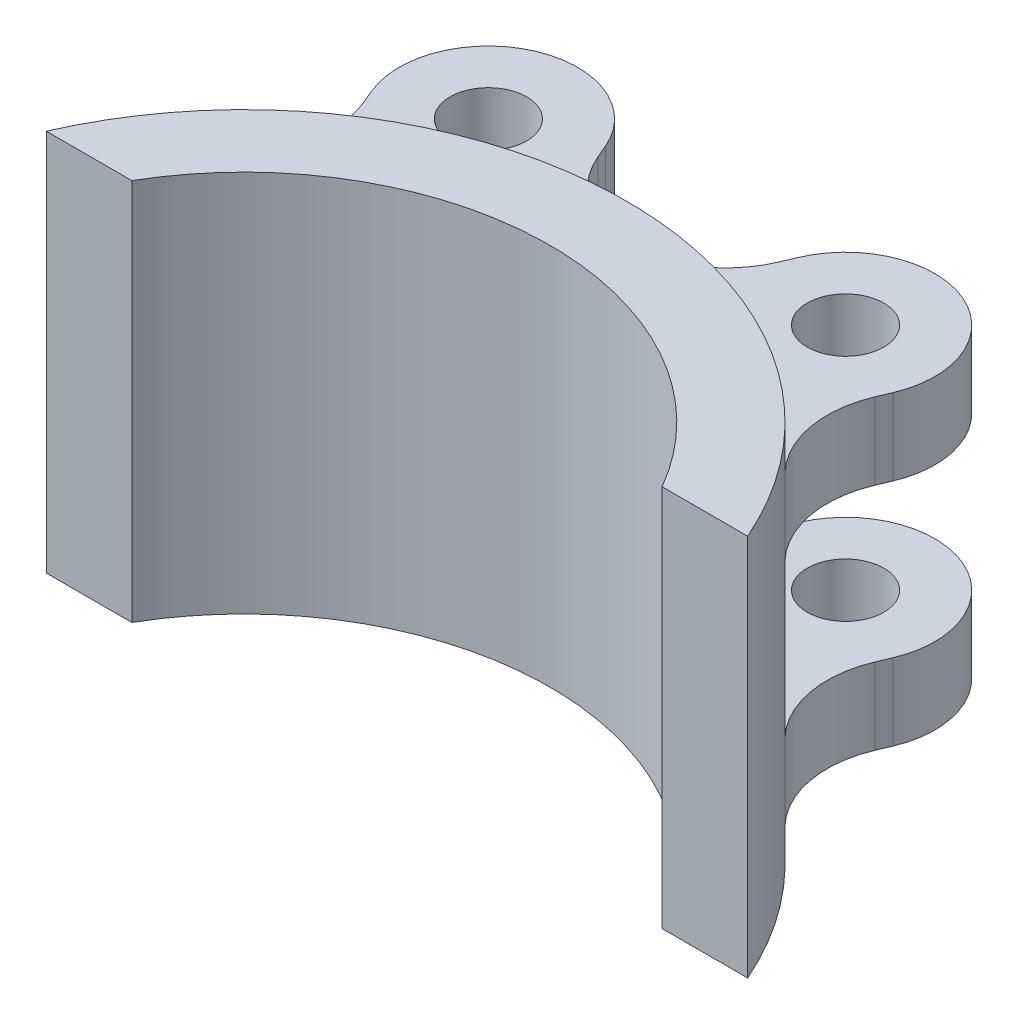
ISO-10303-21;
HEADER;
FILE_DESCRIPTION(('STEP AP214'),'2;1');
FILE_NAME('part.step','',(''),(''),'','','');
FILE_SCHEMA(('AUTOMOTIVE_DESIGN { 1 0 10303 214 1 1 1 1 }'));
ENDSEC;
DATA;
#1=APPLICATION_CONTEXT('core data for automotive mechanical design processes');
#2=APPLICATION_PROTOCOL_DEFINITION('international standard','automotive_design',2000,#1);
#3=PRODUCT_CONTEXT('',#1,'mechanical');
#4=PRODUCT('Part','Part','',(#3));
#5=PRODUCT_RELATED_PRODUCT_CATEGORY('part','',(#4));
#6=PRODUCT_DEFINITION_FORMATION('','',#4);
#7=PRODUCT_DEFINITION_CONTEXT('part definition',#1,'design');
#8=PRODUCT_DEFINITION('design','',#6,#7);
#9=PRODUCT_DEFINITION_SHAPE('','',#8);
#10=(LENGTH_UNIT() NAMED_UNIT(*) SI_UNIT(.MILLI.,.METRE.));
#11=(NAMED_UNIT(*) PLANE_ANGLE_UNIT() SI_UNIT($,.RADIAN.));
#12=(NAMED_UNIT(*) SI_UNIT($,.STERADIAN.) SOLID_ANGLE_UNIT());
#13=UNCERTAINTY_MEASURE_WITH_UNIT(LENGTH_MEASURE(1.E-05),#10,'distance_accuracy_value','');
#14=(GEOMETRIC_REPRESENTATION_CONTEXT(3) GLOBAL_UNCERTAINTY_ASSIGNED_CONTEXT((#13)) GLOBAL_UNIT_ASSIGNED_CONTEXT((#10,
#11,#12)) REPRESENTATION_CONTEXT('',''));
#15=CARTESIAN_POINT('',(0.,0.,0.));
#16=DIRECTION('',(0.,0.,1.));
#17=DIRECTION('',(1.,0.,0.));
#18=AXIS2_PLACEMENT_3D('',#15,#16,#17);
#19=CARTESIAN_POINT('',(-7.,-6.,-16.583123951777));
#20=DIRECTION('',(0.,1.,0.));
#21=DIRECTION('',(0.,0.,1.));
#22=AXIS2_PLACEMENT_3D('',#19,#20,#21);
#23=CYLINDRICAL_SURFACE('',#22,3.5);
#24=DIRECTION('',(0.,1.,0.));
#25=VECTOR('',#24,1.);
#26=CARTESIAN_POINT('',(-10.2244963239566,-6.,-15.2220128406659));
#27=LINE('',#26,#25);
#28=CARTESIAN_POINT('',(-10.2244963239566,-6.,-15.2220128406659));
#29=VERTEX_POINT('',#28);
#30=CARTESIAN_POINT('',(-10.2244963239566,-3.,-15.2220128406659));
#31=VERTEX_POINT('',#30);
#32=EDGE_CURVE('E339',#29,#31,#27,.T.);
#33=ORIENTED_EDGE('',*,*,#32,.T.);
#34=CARTESIAN_POINT('',(-7.,-3.,-16.583123951777));
#35=DIRECTION('',(0.,1.,0.));
#36=DIRECTION('',(0.,0.,1.));
#37=AXIS2_PLACEMENT_3D('',#34,#35,#36);
#38=CIRCLE('',#37,3.5);
#39=CARTESIAN_POINT('',(-3.77550367604336,-3.,-17.9442350628881));
#40=VERTEX_POINT('',#39);
#41=EDGE_CURVE('E370',#31,#40,#38,.F.);
#42=ORIENTED_EDGE('',*,*,#41,.T.);
#43=DIRECTION('',(0.,1.,0.));
#44=VECTOR('',#43,1.);
#45=CARTESIAN_POINT('',(-3.77550367604336,-6.,-17.9442350628881));
#46=LINE('',#45,#44);
#47=CARTESIAN_POINT('',(-3.77550367604336,-6.,-17.9442350628881));
#48=VERTEX_POINT('',#47);
#49=EDGE_CURVE('E334',#48,#40,#46,.T.);
#50=ORIENTED_EDGE('',*,*,#49,.F.);
#51=CARTESIAN_POINT('',(-7.,-6.,-16.583123951777));
#52=DIRECTION('',(0.,1.,0.));
#53=DIRECTION('',(0.,0.,1.));
#54=AXIS2_PLACEMENT_3D('',#51,#52,#53);
#55=CIRCLE('',#54,3.5);
#56=EDGE_CURVE('E324',#48,#29,#55,.T.);
#57=ORIENTED_EDGE('',*,*,#56,.T.);
#58=EDGE_LOOP('',(#33,#42,#50,#57));
#59=FACE_BOUND('',#58,.T.);
#60=ADVANCED_FACE('F33',(#59),#23,.T.);
#61=CARTESIAN_POINT('',(-3.77550367604336,-6.,-17.9442350628881));
#62=DIRECTION('',(0.921284663987611,0.,-0.38888888888889));
#63=DIRECTION('',(-0.38888888888889,0.,-0.921284663987611));
#64=AXIS2_PLACEMENT_3D('',#61,#62,#63);
#65=PLANE('',#64);
#66=ORIENTED_EDGE('',*,*,#49,.T.);
#67=DIRECTION('',(0.38888888888889,0.,0.921284663987611));
#68=VECTOR('',#67,1.);
#69=CARTESIAN_POINT('',(-3.77550367604336,-3.,-17.9442350628881));
#70=LINE('',#69,#68);
#71=CARTESIAN_POINT('',(-3.56375652712757,-3.,-17.4426023176158));
#72=VERTEX_POINT('',#71);
#73=EDGE_CURVE('E242',#40,#72,#70,.T.);
#74=ORIENTED_EDGE('',*,*,#73,.T.);
#75=DIRECTION('',(0.,-1.,0.));
#76=VECTOR('',#75,1.);
#77=CARTESIAN_POINT('',(-3.56375652712757,-6.,-17.4426023176158));
#78=LINE('',#77,#76);
#79=CARTESIAN_POINT('',(-3.56375652712757,-6.,-17.4426023176158));
#80=VERTEX_POINT('',#79);
#81=EDGE_CURVE('E241',#72,#80,#78,.T.);
#82=ORIENTED_EDGE('',*,*,#81,.T.);
#83=DIRECTION('',(-0.38888888888889,0.,-0.921284663987611));
#84=VECTOR('',#83,1.);
#85=CARTESIAN_POINT('',(-3.77550367604336,-6.,-17.9442350628881));
#86=LINE('',#85,#84);
#87=EDGE_CURVE('E331',#80,#48,#86,.T.);
#88=ORIENTED_EDGE('',*,*,#87,.T.);
#89=EDGE_LOOP('',(#66,#74,#82,#88));
#90=FACE_BOUND('',#89,.T.);
#91=ADVANCED_FACE('F372',(#90),#65,.T.);
#92=CARTESIAN_POINT('',(-10.2244963239566,-6.,-15.2220128406659));
#93=DIRECTION('',(-0.921284663987611,0.,0.388888888888889));
#94=DIRECTION('',(0.388888888888889,0.,0.921284663987611));
#95=AXIS2_PLACEMENT_3D('',#92,#93,#94);
#96=PLANE('',#95);
#97=DIRECTION('',(0.,-1.,0.));
#98=VECTOR('',#97,1.);
#99=CARTESIAN_POINT('',(-10.0133647545496,6.,-14.7218384141501));
#100=LINE('',#99,#98);
#101=CARTESIAN_POINT('',(-10.0133647545496,-6.,-14.7218384141501));
#102=VERTEX_POINT('',#101);
#103=CARTESIAN_POINT('',(-10.0133647545496,-3.,-14.7218384141501));
#104=VERTEX_POINT('',#103);
#105=EDGE_CURVE('E264',#102,#104,#100,.F.);
#106=ORIENTED_EDGE('',*,*,#105,.T.);
#107=DIRECTION('',(-0.388888888888889,0.,-0.921284663987611));
#108=VECTOR('',#107,1.);
#109=CARTESIAN_POINT('',(-10.2244963239566,-3.,-15.2220128406659));
#110=LINE('',#109,#108);
#111=EDGE_CURVE('E366',#104,#31,#110,.T.);
#112=ORIENTED_EDGE('',*,*,#111,.T.);
#113=ORIENTED_EDGE('',*,*,#32,.F.);
#114=DIRECTION('',(0.388888888888889,0.,0.921284663987611));
#115=VECTOR('',#114,1.);
#116=CARTESIAN_POINT('',(-10.2244963239566,-6.,-15.2220128406659));
#117=LINE('',#116,#115);
#118=EDGE_CURVE('E327',#29,#102,#117,.T.);
#119=ORIENTED_EDGE('',*,*,#118,.T.);
#120=EDGE_LOOP('',(#106,#112,#113,#119));
#121=FACE_BOUND('',#120,.T.);
#122=ADVANCED_FACE('F365',(#121),#96,.T.);
#123=CARTESIAN_POINT('',(-7.,-6.,-16.583123951777));
#124=DIRECTION('',(0.,1.,0.));
#125=DIRECTION('',(0.,0.,1.));
#126=AXIS2_PLACEMENT_3D('',#123,#124,#125);
#127=CYLINDRICAL_SURFACE('',#126,1.5);
#128=CARTESIAN_POINT('',(-7.,-6.,-16.583123951777));
#129=DIRECTION('',(0.,1.,0.));
#130=DIRECTION('',(0.,0.,1.));
#131=AXIS2_PLACEMENT_3D('',#128,#129,#130);
#132=CIRCLE('',#131,1.5);
#133=CARTESIAN_POINT('',(-7.,-6.,-15.083123951777));
#134=VERTEX_POINT('',#133);
#135=EDGE_CURVE('E321',#134,#134,#132,.T.);
#136=ORIENTED_EDGE('',*,*,#135,.F.);
#137=EDGE_LOOP('',(#136));
#138=FACE_BOUND('',#137,.T.);
#139=CARTESIAN_POINT('',(-7.,-3.,-16.583123951777));
#140=DIRECTION('',(0.,1.,0.));
#141=DIRECTION('',(0.,0.,1.));
#142=AXIS2_PLACEMENT_3D('',#139,#140,#141);
#143=CIRCLE('',#142,1.5);
#144=CARTESIAN_POINT('',(-7.,-3.,-15.083123951777));
#145=VERTEX_POINT('',#144);
#146=EDGE_CURVE('E381',#145,#145,#143,.F.);
#147=ORIENTED_EDGE('',*,*,#146,.F.);
#148=EDGE_LOOP('',(#147));
#149=FACE_BOUND('',#148,.T.);
#150=ADVANCED_FACE('F558',(#138,#149),#127,.F.);
#151=CARTESIAN_POINT('',(0.121382128822869,-7.5,-18.9981578731714));
#152=DIRECTION('',(0.,1.,0.));
#153=DIRECTION('',(0.,0.,1.));
#154=AXIS2_PLACEMENT_3D('',#151,#152,#153);
#155=CYLINDRICAL_SURFACE('',#154,4.);
#156=CARTESIAN_POINT('',(0.121382128822869,-3.,-18.9981578731714));
#157=DIRECTION('',(0.,1.,0.));
#158=DIRECTION('',(0.,0.,1.));
#159=AXIS2_PLACEMENT_3D('',#156,#157,#158);
#160=CIRCLE('',#159,4.);
#161=CARTESIAN_POINT('',(0.,-3.,-15.));
#162=VERTEX_POINT('',#161);
#163=EDGE_CURVE('E215',#162,#72,#160,.F.);
#164=ORIENTED_EDGE('',*,*,#163,.F.);
#165=DIRECTION('',(0.,1.,0.));
#166=VECTOR('',#165,1.);
#167=CARTESIAN_POINT('',(0.,-7.5,-15.));
#168=LINE('',#167,#166);
#169=CARTESIAN_POINT('',(0.,-6.,-15.));
#170=VERTEX_POINT('',#169);
#171=EDGE_CURVE('E239',#170,#162,#168,.T.);
#172=ORIENTED_EDGE('',*,*,#171,.F.);
#173=CARTESIAN_POINT('',(0.121382128822869,-6.,-18.9981578731714));
#174=DIRECTION('',(0.,1.,0.));
#175=DIRECTION('',(0.,0.,1.));
#176=AXIS2_PLACEMENT_3D('',#173,#174,#175);
#177=CIRCLE('',#176,4.);
#178=EDGE_CURVE('E269',#80,#170,#177,.T.);
#179=ORIENTED_EDGE('',*,*,#178,.F.);
#180=ORIENTED_EDGE('',*,*,#81,.F.);
#181=EDGE_LOOP('',(#164,#172,#179,#180));
#182=FACE_BOUND('',#181,.T.);
#183=ADVANCED_FACE('F237',(#182),#155,.F.);
#184=CARTESIAN_POINT('',(-13.6985034105,-7.5,-13.1662828585945));
#185=DIRECTION('',(0.,1.,0.));
#186=DIRECTION('',(0.,0.,1.));
#187=AXIS2_PLACEMENT_3D('',#184,#185,#186);
#188=CYLINDRICAL_SURFACE('',#187,4.);
#189=CARTESIAN_POINT('',(-13.6985034105,-3.,-13.1662828585945));
#190=DIRECTION('',(0.,1.,0.));
#191=DIRECTION('',(0.,0.,1.));
#192=AXIS2_PLACEMENT_3D('',#189,#190,#191);
#193=CIRCLE('',#192,4.);
#194=CARTESIAN_POINT('',(-10.8146079556579,-3.,-10.3944338357325));
#195=VERTEX_POINT('',#194);
#196=EDGE_CURVE('E225',#104,#195,#193,.F.);
#197=ORIENTED_EDGE('',*,*,#196,.F.);
#198=ORIENTED_EDGE('',*,*,#105,.F.);
#199=CARTESIAN_POINT('',(-13.6985034105,-6.,-13.1662828585945));
#200=DIRECTION('',(0.,1.,0.));
#201=DIRECTION('',(0.,0.,1.));
#202=AXIS2_PLACEMENT_3D('',#199,#200,#201);
#203=CIRCLE('',#202,4.);
#204=CARTESIAN_POINT('',(-10.8146079556579,-6.,-10.3944338357325));
#205=VERTEX_POINT('',#204);
#206=EDGE_CURVE('E56',#205,#102,#203,.T.);
#207=ORIENTED_EDGE('',*,*,#206,.F.);
#208=DIRECTION('',(0.,1.,0.));
#209=VECTOR('',#208,1.);
#210=CARTESIAN_POINT('',(-10.8146079556579,-7.5,-10.3944338357325));
#211=LINE('',#210,#209);
#212=EDGE_CURVE('E259',#195,#205,#211,.F.);
#213=ORIENTED_EDGE('',*,*,#212,.F.);
#214=EDGE_LOOP('',(#197,#198,#207,#213));
#215=FACE_BOUND('',#214,.T.);
#216=ADVANCED_FACE('F362',(#215),#188,.F.);
#217=CARTESIAN_POINT('',(7.,-6.,-16.583123951777));
#218=DIRECTION('',(0.,1.,0.));
#219=DIRECTION('',(0.,0.,1.));
#220=AXIS2_PLACEMENT_3D('',#217,#218,#219);
#221=CYLINDRICAL_SURFACE('',#220,3.5);
#222=DIRECTION('',(0.,1.,0.));
#223=VECTOR('',#222,1.);
#224=CARTESIAN_POINT('',(3.77550367604336,-6.,-17.9442350628881));
#225=LINE('',#224,#223);
#226=CARTESIAN_POINT('',(3.77550367604336,-6.,-17.9442350628881));
#227=VERTEX_POINT('',#226);
#228=CARTESIAN_POINT('',(3.77550367604336,-3.,-17.9442350628881));
#229=VERTEX_POINT('',#228);
#230=EDGE_CURVE('E439',#227,#229,#225,.T.);
#231=ORIENTED_EDGE('',*,*,#230,.T.);
#232=CARTESIAN_POINT('',(7.,-3.,-16.583123951777));
#233=DIRECTION('',(0.,1.,0.));
#234=DIRECTION('',(0.,0.,1.));
#235=AXIS2_PLACEMENT_3D('',#232,#233,#234);
#236=CIRCLE('',#235,3.5);
#237=CARTESIAN_POINT('',(10.2244963239566,-3.,-15.2220128406659));
#238=VERTEX_POINT('',#237);
#239=EDGE_CURVE('E288',#229,#238,#236,.F.);
#240=ORIENTED_EDGE('',*,*,#239,.T.);
#241=DIRECTION('',(0.,1.,0.));
#242=VECTOR('',#241,1.);
#243=CARTESIAN_POINT('',(10.2244963239566,-6.,-15.2220128406659));
#244=LINE('',#243,#242);
#245=CARTESIAN_POINT('',(10.2244963239566,-6.,-15.2220128406659));
#246=VERTEX_POINT('',#245);
#247=EDGE_CURVE('E287',#246,#238,#244,.T.);
#248=ORIENTED_EDGE('',*,*,#247,.F.);
#249=CARTESIAN_POINT('',(7.,-6.,-16.583123951777));
#250=DIRECTION('',(0.,-1.,0.));
#251=DIRECTION('',(0.,0.,1.));
#252=AXIS2_PLACEMENT_3D('',#249,#250,#251);
#253=CIRCLE('',#252,3.5);
#254=EDGE_CURVE('E429',#227,#246,#253,.T.);
#255=ORIENTED_EDGE('',*,*,#254,.F.);
#256=EDGE_LOOP('',(#231,#240,#248,#255));
#257=FACE_BOUND('',#256,.T.);
#258=ADVANCED_FACE('F465',(#257),#221,.T.);
#259=CARTESIAN_POINT('',(3.77550367604336,-6.,-17.9442350628881));
#260=DIRECTION('',(-0.921284663987611,0.,-0.388888888888889));
#261=DIRECTION('',(0.388888888888889,0.,-0.921284663987611));
#262=AXIS2_PLACEMENT_3D('',#259,#260,#261);
#263=PLANE('',#262);
#264=DIRECTION('',(0.,-1.,0.));
#265=VECTOR('',#264,1.);
#266=CARTESIAN_POINT('',(3.56375652712757,-6.,-17.4426023176158));
#267=LINE('',#266,#265);
#268=CARTESIAN_POINT('',(3.56375652712757,-3.,-17.4426023176158));
#269=VERTEX_POINT('',#268);
#270=CARTESIAN_POINT('',(3.56375652712757,-6.,-17.4426023176158));
#271=VERTEX_POINT('',#270);
#272=EDGE_CURVE('E456',#269,#271,#267,.T.);
#273=ORIENTED_EDGE('',*,*,#272,.F.);
#274=DIRECTION('',(0.388888888888889,0.,-0.921284663987611));
#275=VECTOR('',#274,1.);
#276=CARTESIAN_POINT('',(3.77550367604336,-3.,-17.9442350628881));
#277=LINE('',#276,#275);
#278=EDGE_CURVE('E211',#269,#229,#277,.T.);
#279=ORIENTED_EDGE('',*,*,#278,.T.);
#280=ORIENTED_EDGE('',*,*,#230,.F.);
#281=DIRECTION('',(0.388888888888889,0.,-0.921284663987611));
#282=VECTOR('',#281,1.);
#283=CARTESIAN_POINT('',(3.77550367604336,-6.,-17.9442350628881));
#284=LINE('',#283,#282);
#285=EDGE_CURVE('E436',#271,#227,#284,.T.);
#286=ORIENTED_EDGE('',*,*,#285,.F.);
#287=EDGE_LOOP('',(#273,#279,#280,#286));
#288=FACE_BOUND('',#287,.T.);
#289=ADVANCED_FACE('F605',(#288),#263,.T.);
#290=CARTESIAN_POINT('',(10.2244963239566,-6.,-15.2220128406659));
#291=DIRECTION('',(0.921284663987611,0.,0.388888888888889));
#292=DIRECTION('',(-0.388888888888889,0.,0.921284663987611));
#293=AXIS2_PLACEMENT_3D('',#290,#291,#292);
#294=PLANE('',#293);
#295=ORIENTED_EDGE('',*,*,#247,.T.);
#296=DIRECTION('',(-0.388888888888889,0.,0.921284663987611));
#297=VECTOR('',#296,1.);
#298=CARTESIAN_POINT('',(10.2244963239566,-3.,-15.2220128406659));
#299=LINE('',#298,#297);
#300=CARTESIAN_POINT('',(10.0133647545496,-3.,-14.7218384141501));
#301=VERTEX_POINT('',#300);
#302=EDGE_CURVE('E276',#238,#301,#299,.T.);
#303=ORIENTED_EDGE('',*,*,#302,.T.);
#304=DIRECTION('',(0.,-1.,0.));
#305=VECTOR('',#304,1.);
#306=CARTESIAN_POINT('',(10.0133647545496,6.,-14.7218384141501));
#307=LINE('',#306,#305);
#308=CARTESIAN_POINT('',(10.0133647545496,-6.,-14.7218384141501));
#309=VERTEX_POINT('',#308);
#310=EDGE_CURVE('E284',#309,#301,#307,.F.);
#311=ORIENTED_EDGE('',*,*,#310,.F.);
#312=DIRECTION('',(-0.388888888888889,0.,0.921284663987611));
#313=VECTOR('',#312,1.);
#314=CARTESIAN_POINT('',(10.2244963239566,-6.,-15.2220128406659));
#315=LINE('',#314,#313);
#316=EDGE_CURVE('E432',#246,#309,#315,.T.);
#317=ORIENTED_EDGE('',*,*,#316,.F.);
#318=EDGE_LOOP('',(#295,#303,#311,#317));
#319=FACE_BOUND('',#318,.T.);
#320=ADVANCED_FACE('F283',(#319),#294,.T.);
#321=CARTESIAN_POINT('',(7.,-6.,-16.583123951777));
#322=DIRECTION('',(0.,1.,0.));
#323=DIRECTION('',(0.,0.,1.));
#324=AXIS2_PLACEMENT_3D('',#321,#322,#323);
#325=CYLINDRICAL_SURFACE('',#324,1.5);
#326=CARTESIAN_POINT('',(7.,-6.,-16.583123951777));
#327=DIRECTION('',(0.,-1.,0.));
#328=DIRECTION('',(0.,0.,1.));
#329=AXIS2_PLACEMENT_3D('',#326,#327,#328);
#330=CIRCLE('',#329,1.5);
#331=CARTESIAN_POINT('',(7.,-6.,-15.083123951777));
#332=VERTEX_POINT('',#331);
#333=EDGE_CURVE('E426',#332,#332,#330,.T.);
#334=ORIENTED_EDGE('',*,*,#333,.T.);
#335=EDGE_LOOP('',(#334));
#336=FACE_BOUND('',#335,.T.);
#337=CARTESIAN_POINT('',(7.,-3.,-16.583123951777));
#338=DIRECTION('',(0.,1.,0.));
#339=DIRECTION('',(0.,0.,1.));
#340=AXIS2_PLACEMENT_3D('',#337,#338,#339);
#341=CIRCLE('',#340,1.5);
#342=CARTESIAN_POINT('',(7.,-3.,-15.083123951777));
#343=VERTEX_POINT('',#342);
#344=EDGE_CURVE('E378',#343,#343,#341,.F.);
#345=ORIENTED_EDGE('',*,*,#344,.F.);
#346=EDGE_LOOP('',(#345));
#347=FACE_BOUND('',#346,.T.);
#348=ADVANCED_FACE('F595',(#336,#347),#325,.F.);
#349=CARTESIAN_POINT('',(-0.121382128822874,-7.5,-18.9981578731714));
#350=DIRECTION('',(0.,1.,0.));
#351=DIRECTION('',(0.,0.,1.));
#352=AXIS2_PLACEMENT_3D('',#349,#350,#351);
#353=CYLINDRICAL_SURFACE('',#352,4.);
#354=CARTESIAN_POINT('',(-0.121382128822874,-3.,-18.9981578731714));
#355=DIRECTION('',(0.,1.,0.));
#356=DIRECTION('',(0.,0.,1.));
#357=AXIS2_PLACEMENT_3D('',#354,#355,#356);
#358=CIRCLE('',#357,4.);
#359=EDGE_CURVE('E206',#269,#162,#358,.F.);
#360=ORIENTED_EDGE('',*,*,#359,.F.);
#361=ORIENTED_EDGE('',*,*,#272,.T.);
#362=CARTESIAN_POINT('',(-0.121382128822874,-6.,-18.9981578731714));
#363=DIRECTION('',(0.,-1.,0.));
#364=DIRECTION('',(0.,0.,1.));
#365=AXIS2_PLACEMENT_3D('',#362,#363,#364);
#366=CIRCLE('',#365,4.);
#367=EDGE_CURVE('E246',#271,#170,#366,.T.);
#368=ORIENTED_EDGE('',*,*,#367,.T.);
#369=ORIENTED_EDGE('',*,*,#171,.T.);
#370=EDGE_LOOP('',(#360,#361,#368,#369));
#371=FACE_BOUND('',#370,.T.);
#372=ADVANCED_FACE('F244',(#371),#353,.F.);
#373=CARTESIAN_POINT('',(13.6985034105,-7.5,-13.1662828585945));
#374=DIRECTION('',(0.,1.,0.));
#375=DIRECTION('',(0.,0.,1.));
#376=AXIS2_PLACEMENT_3D('',#373,#374,#375);
#377=CYLINDRICAL_SURFACE('',#376,4.);
#378=CARTESIAN_POINT('',(13.6985034105,-3.,-13.1662828585945));
#379=DIRECTION('',(0.,1.,0.));
#380=DIRECTION('',(0.,0.,1.));
#381=AXIS2_PLACEMENT_3D('',#378,#379,#380);
#382=CIRCLE('',#381,4.);
#383=CARTESIAN_POINT('',(10.8146079556579,-3.,-10.3944338357325));
#384=VERTEX_POINT('',#383);
#385=EDGE_CURVE('E41',#384,#301,#382,.F.);
#386=ORIENTED_EDGE('',*,*,#385,.F.);
#387=DIRECTION('',(0.,1.,0.));
#388=VECTOR('',#387,1.);
#389=CARTESIAN_POINT('',(10.8146079556579,-7.5,-10.3944338357325));
#390=LINE('',#389,#388);
#391=CARTESIAN_POINT('',(10.8146079556579,-6.,-10.3944338357325));
#392=VERTEX_POINT('',#391);
#393=EDGE_CURVE('E232',#384,#392,#390,.F.);
#394=ORIENTED_EDGE('',*,*,#393,.T.);
#395=CARTESIAN_POINT('',(13.6985034105,-6.,-13.1662828585945));
#396=DIRECTION('',(0.,-1.,0.));
#397=DIRECTION('',(0.,0.,1.));
#398=AXIS2_PLACEMENT_3D('',#395,#396,#397);
#399=CIRCLE('',#398,4.);
#400=EDGE_CURVE('E293',#392,#309,#399,.T.);
#401=ORIENTED_EDGE('',*,*,#400,.T.);
#402=ORIENTED_EDGE('',*,*,#310,.T.);
#403=EDGE_LOOP('',(#386,#394,#401,#402));
#404=FACE_BOUND('',#403,.T.);
#405=ADVANCED_FACE('F291',(#404),#377,.F.);
#406=CARTESIAN_POINT('',(0.,-7.5,0.));
#407=DIRECTION('',(0.,1.,0.));
#408=DIRECTION('',(0.,0.,1.));
#409=AXIS2_PLACEMENT_3D('',#406,#407,#408);
#410=CYLINDRICAL_SURFACE('',#409,15.);
#411=CARTESIAN_POINT('',(-10.8146079556579,6.,-10.3944338357325));
#412=VERTEX_POINT('',#411);
#413=CARTESIAN_POINT('',(-10.8146079556579,3.,-10.3944338357325));
#414=VERTEX_POINT('',#413);
#415=EDGE_CURVE('E256',#412,#414,#211,.F.);
#416=ORIENTED_EDGE('',*,*,#415,.T.);
#417=CARTESIAN_POINT('',(0.,3.,0.));
#418=DIRECTION('',(0.,1.,0.));
#419=DIRECTION('',(0.,0.,1.));
#420=AXIS2_PLACEMENT_3D('',#417,#418,#419);
#421=CIRCLE('',#420,15.);
#422=CARTESIAN_POINT('',(0.,3.,-15.));
#423=VERTEX_POINT('',#422);
#424=EDGE_CURVE('E233',#423,#414,#421,.T.);
#425=ORIENTED_EDGE('',*,*,#424,.F.);
#426=CARTESIAN_POINT('',(10.8146079556579,3.,-10.3944338357325));
#427=VERTEX_POINT('',#426);
#428=EDGE_CURVE('E289',#427,#423,#421,.T.);
#429=ORIENTED_EDGE('',*,*,#428,.F.);
#430=CARTESIAN_POINT('',(10.8146079556579,6.,-10.3944338357325));
#431=VERTEX_POINT('',#430);
#432=EDGE_CURVE('E454',#431,#427,#390,.F.);
#433=ORIENTED_EDGE('',*,*,#432,.F.);
#434=CARTESIAN_POINT('',(0.,6.,0.));
#435=DIRECTION('',(0.,1.,0.));
#436=DIRECTION('',(0.,0.,1.));
#437=AXIS2_PLACEMENT_3D('',#434,#435,#436);
#438=CIRCLE('',#437,15.);
#439=CARTESIAN_POINT('',(0.,6.,-15.));
#440=VERTEX_POINT('',#439);
#441=EDGE_CURVE('E420',#431,#440,#438,.T.);
#442=ORIENTED_EDGE('',*,*,#441,.T.);
#443=CARTESIAN_POINT('',(0.,6.,0.));
#444=DIRECTION('',(0.,-1.,0.));
#445=DIRECTION('',(0.,0.,1.));
#446=AXIS2_PLACEMENT_3D('',#443,#444,#445);
#447=CIRCLE('',#446,15.);
#448=EDGE_CURVE('E315',#412,#440,#447,.T.);
#449=ORIENTED_EDGE('',*,*,#448,.F.);
#450=EDGE_LOOP('',(#416,#425,#429,#433,#442,#449));
#451=FACE_BOUND('',#450,.T.);
#452=DIRECTION('',(0.,1.,0.));
#453=VECTOR('',#452,1.);
#454=CARTESIAN_POINT('',(-13.7477270848675,-7.5,-5.99999999999998));
#455=LINE('',#454,#453);
#456=CARTESIAN_POINT('',(-13.7477270848675,-7.5,-5.99999999999998));
#457=VERTEX_POINT('',#456);
#458=CARTESIAN_POINT('',(-13.7477270848675,7.5,-5.99999999999998));
#459=VERTEX_POINT('',#458);
#460=EDGE_CURVE('E248',#457,#459,#455,.T.);
#461=ORIENTED_EDGE('',*,*,#460,.T.);
#462=CARTESIAN_POINT('',(0.,7.5,0.));
#463=DIRECTION('',(0.,1.,0.));
#464=DIRECTION('',(0.,0.,1.));
#465=AXIS2_PLACEMENT_3D('',#462,#463,#464);
#466=CIRCLE('',#465,15.);
#467=CARTESIAN_POINT('',(13.7477270848675,7.5,-5.99999999999998));
#468=VERTEX_POINT('',#467);
#469=EDGE_CURVE('E343',#468,#459,#466,.T.);
#470=ORIENTED_EDGE('',*,*,#469,.F.);
#471=DIRECTION('',(0.,1.,0.));
#472=VECTOR('',#471,1.);
#473=CARTESIAN_POINT('',(13.7477270848675,-7.5,-5.99999999999998));
#474=LINE('',#473,#472);
#475=CARTESIAN_POINT('',(13.7477270848675,-7.5,-5.99999999999998));
#476=VERTEX_POINT('',#475);
#477=EDGE_CURVE('E450',#476,#468,#474,.T.);
#478=ORIENTED_EDGE('',*,*,#477,.F.);
#479=CARTESIAN_POINT('',(0.,-7.5,0.));
#480=DIRECTION('',(0.,1.,0.));
#481=DIRECTION('',(0.,0.,1.));
#482=AXIS2_PLACEMENT_3D('',#479,#480,#481);
#483=CIRCLE('',#482,15.);
#484=EDGE_CURVE('E351',#476,#457,#483,.T.);
#485=ORIENTED_EDGE('',*,*,#484,.T.);
#486=EDGE_LOOP('',(#461,#470,#478,#485));
#487=FACE_BOUND('',#486,.T.);
#488=CARTESIAN_POINT('',(0.,-3.,0.));
#489=DIRECTION('',(0.,1.,0.));
#490=DIRECTION('',(0.,0.,1.));
#491=AXIS2_PLACEMENT_3D('',#488,#489,#490);
#492=CIRCLE('',#491,15.);
#493=EDGE_CURVE('E219',#162,#195,#492,.T.);
#494=ORIENTED_EDGE('',*,*,#493,.T.);
#495=ORIENTED_EDGE('',*,*,#212,.T.);
#496=CARTESIAN_POINT('',(0.,-6.,0.));
#497=DIRECTION('',(0.,-1.,0.));
#498=DIRECTION('',(0.,0.,1.));
#499=AXIS2_PLACEMENT_3D('',#496,#497,#498);
#500=CIRCLE('',#499,15.);
#501=EDGE_CURVE('E329',#205,#170,#500,.T.);
#502=ORIENTED_EDGE('',*,*,#501,.T.);
#503=CARTESIAN_POINT('',(0.,-6.,0.));
#504=DIRECTION('',(0.,1.,0.));
#505=DIRECTION('',(0.,0.,1.));
#506=AXIS2_PLACEMENT_3D('',#503,#504,#505);
#507=CIRCLE('',#506,15.);
#508=EDGE_CURVE('E434',#392,#170,#507,.T.);
#509=ORIENTED_EDGE('',*,*,#508,.F.);
#510=ORIENTED_EDGE('',*,*,#393,.F.);
#511=EDGE_CURVE('E48',#384,#162,#492,.T.);
#512=ORIENTED_EDGE('',*,*,#511,.T.);
#513=EDGE_LOOP('',(#494,#495,#502,#509,#510,#512));
#514=FACE_BOUND('',#513,.T.);
#515=ADVANCED_FACE('F230',(#451,#487,#514),#410,.T.);
#516=CARTESIAN_POINT('',(0.,-7.5,0.));
#517=DIRECTION('',(0.,1.,0.));
#518=DIRECTION('',(0.,0.,1.));
#519=AXIS2_PLACEMENT_3D('',#516,#517,#518);
#520=CYLINDRICAL_SURFACE('',#519,12.);
#521=CARTESIAN_POINT('',(0.,-7.5,0.));
#522=DIRECTION('',(0.,-1.,0.));
#523=DIRECTION('',(0.,0.,1.));
#524=AXIS2_PLACEMENT_3D('',#521,#522,#523);
#525=CIRCLE('',#524,12.);
#526=CARTESIAN_POINT('',(-10.3923048454133,-7.5,-5.99999999999997));
#527=VERTEX_POINT('',#526);
#528=CARTESIAN_POINT('',(10.3923048454133,-7.5,-5.99999999999997));
#529=VERTEX_POINT('',#528);
#530=EDGE_CURVE('E349',#527,#529,#525,.T.);
#531=ORIENTED_EDGE('',*,*,#530,.T.);
#532=DIRECTION('',(0.,1.,0.));
#533=VECTOR('',#532,1.);
#534=CARTESIAN_POINT('',(10.3923048454133,-7.5,-5.99999999999997));
#535=LINE('',#534,#533);
#536=CARTESIAN_POINT('',(10.3923048454133,7.5,-5.99999999999997));
#537=VERTEX_POINT('',#536);
#538=EDGE_CURVE('E451',#529,#537,#535,.T.);
#539=ORIENTED_EDGE('',*,*,#538,.T.);
#540=CARTESIAN_POINT('',(0.,7.5,0.));
#541=DIRECTION('',(0.,-1.,0.));
#542=DIRECTION('',(0.,0.,1.));
#543=AXIS2_PLACEMENT_3D('',#540,#541,#542);
#544=CIRCLE('',#543,12.);
#545=CARTESIAN_POINT('',(-10.3923048454133,7.5,-5.99999999999997));
#546=VERTEX_POINT('',#545);
#547=EDGE_CURVE('E337',#546,#537,#544,.T.);
#548=ORIENTED_EDGE('',*,*,#547,.F.);
#549=DIRECTION('',(0.,1.,0.));
#550=VECTOR('',#549,1.);
#551=CARTESIAN_POINT('',(-10.3923048454133,-7.5,-5.99999999999997));
#552=LINE('',#551,#550);
#553=EDGE_CURVE('E251',#527,#546,#552,.T.);
#554=ORIENTED_EDGE('',*,*,#553,.F.);
#555=EDGE_LOOP('',(#531,#539,#548,#554));
#556=FACE_BOUND('',#555,.T.);
#557=ADVANCED_FACE('F544',(#556),#520,.F.);
#558=CARTESIAN_POINT('',(-10.3923048454133,-7.5,-5.99999999999997));
#559=DIRECTION('',(0.,0.,1.));
#560=DIRECTION('',(1.,0.,0.));
#561=AXIS2_PLACEMENT_3D('',#558,#559,#560);
#562=PLANE('',#561);
#563=ORIENTED_EDGE('',*,*,#553,.T.);
#564=DIRECTION('',(1.,0.,0.));
#565=VECTOR('',#564,1.);
#566=CARTESIAN_POINT('',(-10.3923048454133,7.5,-5.99999999999997));
#567=LINE('',#566,#565);
#568=EDGE_CURVE('E346',#459,#546,#567,.T.);
#569=ORIENTED_EDGE('',*,*,#568,.F.);
#570=ORIENTED_EDGE('',*,*,#460,.F.);
#571=DIRECTION('',(1.,0.,0.));
#572=VECTOR('',#571,1.);
#573=CARTESIAN_POINT('',(-10.3923048454133,-7.5,-5.99999999999997));
#574=LINE('',#573,#572);
#575=EDGE_CURVE('E253',#457,#527,#574,.T.);
#576=ORIENTED_EDGE('',*,*,#575,.T.);
#577=EDGE_LOOP('',(#563,#569,#570,#576));
#578=FACE_BOUND('',#577,.T.);
#579=ADVANCED_FACE('F540',(#578),#562,.T.);
#580=CARTESIAN_POINT('',(0.,-7.5,0.));
#581=DIRECTION('',(0.,1.,0.));
#582=DIRECTION('',(0.,0.,1.));
#583=AXIS2_PLACEMENT_3D('',#580,#581,#582);
#584=PLANE('',#583);
#585=ORIENTED_EDGE('',*,*,#530,.F.);
#586=ORIENTED_EDGE('',*,*,#575,.F.);
#587=ORIENTED_EDGE('',*,*,#484,.F.);
#588=DIRECTION('',(-1.,0.,0.));
#589=VECTOR('',#588,1.);
#590=CARTESIAN_POINT('',(10.3923048454133,-7.5,-5.99999999999997));
#591=LINE('',#590,#589);
#592=EDGE_CURVE('E447',#476,#529,#591,.T.);
#593=ORIENTED_EDGE('',*,*,#592,.T.);
#594=EDGE_LOOP('',(#585,#586,#587,#593));
#595=FACE_BOUND('',#594,.T.);
#596=ADVANCED_FACE('F536',(#595),#584,.F.);
#597=CARTESIAN_POINT('',(0.,7.5,0.));
#598=DIRECTION('',(0.,1.,0.));
#599=DIRECTION('',(0.,0.,1.));
#600=AXIS2_PLACEMENT_3D('',#597,#598,#599);
#601=PLANE('',#600);
#602=ORIENTED_EDGE('',*,*,#547,.T.);
#603=DIRECTION('',(-1.,0.,0.));
#604=VECTOR('',#603,1.);
#605=CARTESIAN_POINT('',(10.3923048454133,7.5,-5.99999999999997));
#606=LINE('',#605,#604);
#607=EDGE_CURVE('E442',#468,#537,#606,.T.);
#608=ORIENTED_EDGE('',*,*,#607,.F.);
#609=ORIENTED_EDGE('',*,*,#469,.T.);
#610=ORIENTED_EDGE('',*,*,#568,.T.);
#611=EDGE_LOOP('',(#602,#608,#609,#610));
#612=FACE_BOUND('',#611,.T.);
#613=ADVANCED_FACE('F526',(#612),#601,.T.);
#614=CARTESIAN_POINT('',(-7.,3.,-16.583123951777));
#615=DIRECTION('',(0.,1.,0.));
#616=DIRECTION('',(0.,0.,1.));
#617=AXIS2_PLACEMENT_3D('',#614,#615,#616);
#618=CIRCLE('',#617,3.5);
#619=CARTESIAN_POINT('',(-10.2244963239566,3.,-15.2220128406659));
#620=VERTEX_POINT('',#619);
#621=CARTESIAN_POINT('',(-3.77550367604336,3.,-17.9442350628881));
#622=VERTEX_POINT('',#621);
#623=EDGE_CURVE('E398',#620,#622,#618,.F.);
#624=ORIENTED_EDGE('',*,*,#623,.F.);
#625=CARTESIAN_POINT('',(-10.2244963239566,6.,-15.2220128406659));
#626=VERTEX_POINT('',#625);
#627=EDGE_CURVE('E333',#620,#626,#27,.T.);
#628=ORIENTED_EDGE('',*,*,#627,.T.);
#629=CARTESIAN_POINT('',(-7.,6.,-16.583123951777));
#630=DIRECTION('',(0.,1.,0.));
#631=DIRECTION('',(0.,0.,1.));
#632=AXIS2_PLACEMENT_3D('',#629,#630,#631);
#633=CIRCLE('',#632,3.5);
#634=CARTESIAN_POINT('',(-3.77550367604336,6.,-17.9442350628881));
#635=VERTEX_POINT('',#634);
#636=EDGE_CURVE('E309',#635,#626,#633,.T.);
#637=ORIENTED_EDGE('',*,*,#636,.F.);
#638=EDGE_CURVE('E338',#622,#635,#46,.T.);
#639=ORIENTED_EDGE('',*,*,#638,.F.);
#640=EDGE_LOOP('',(#624,#628,#637,#639));
#641=FACE_BOUND('',#640,.T.);
#642=ADVANCED_FACE('F514',(#641),#23,.T.);
#643=DIRECTION('',(0.38888888888889,0.,0.921284663987611));
#644=VECTOR('',#643,1.);
#645=CARTESIAN_POINT('',(-3.77550367604336,3.,-17.9442350628881));
#646=LINE('',#645,#644);
#647=CARTESIAN_POINT('',(-3.56375652712757,3.,-17.4426023176158));
#648=VERTEX_POINT('',#647);
#649=EDGE_CURVE('E396',#622,#648,#646,.T.);
#650=ORIENTED_EDGE('',*,*,#649,.F.);
#651=ORIENTED_EDGE('',*,*,#638,.T.);
#652=DIRECTION('',(-0.38888888888889,0.,-0.921284663987611));
#653=VECTOR('',#652,1.);
#654=CARTESIAN_POINT('',(-3.77550367604336,6.,-17.9442350628881));
#655=LINE('',#654,#653);
#656=CARTESIAN_POINT('',(-3.56375652712757,6.,-17.4426023176158));
#657=VERTEX_POINT('',#656);
#658=EDGE_CURVE('E318',#657,#635,#655,.T.);
#659=ORIENTED_EDGE('',*,*,#658,.F.);
#660=EDGE_CURVE('E260',#657,#648,#78,.T.);
#661=ORIENTED_EDGE('',*,*,#660,.T.);
#662=EDGE_LOOP('',(#650,#651,#659,#661));
#663=FACE_BOUND('',#662,.T.);
#664=ADVANCED_FACE('F518',(#663),#65,.T.);
#665=DIRECTION('',(-0.388888888888889,0.,-0.921284663987611));
#666=VECTOR('',#665,1.);
#667=CARTESIAN_POINT('',(-10.2244963239566,3.,-15.2220128406659));
#668=LINE('',#667,#666);
#669=CARTESIAN_POINT('',(-10.0133647545496,3.,-14.7218384141501));
#670=VERTEX_POINT('',#669);
#671=EDGE_CURVE('E400',#670,#620,#668,.T.);
#672=ORIENTED_EDGE('',*,*,#671,.F.);
#673=CARTESIAN_POINT('',(-10.0133647545496,6.,-14.7218384141501));
#674=VERTEX_POINT('',#673);
#675=EDGE_CURVE('E263',#670,#674,#100,.F.);
#676=ORIENTED_EDGE('',*,*,#675,.T.);
#677=DIRECTION('',(0.388888888888889,0.,0.921284663987611));
#678=VECTOR('',#677,1.);
#679=CARTESIAN_POINT('',(-10.2244963239566,6.,-15.2220128406659));
#680=LINE('',#679,#678);
#681=EDGE_CURVE('E312',#626,#674,#680,.T.);
#682=ORIENTED_EDGE('',*,*,#681,.F.);
#683=ORIENTED_EDGE('',*,*,#627,.F.);
#684=EDGE_LOOP('',(#672,#676,#682,#683));
#685=FACE_BOUND('',#684,.T.);
#686=ADVANCED_FACE('F511',(#685),#96,.T.);
#687=CARTESIAN_POINT('',(-7.,-6.,-16.583123951777));
#688=DIRECTION('',(0.,1.,0.));
#689=DIRECTION('',(0.,0.,1.));
#690=AXIS2_PLACEMENT_3D('',#687,#688,#689);
#691=PLANE('',#690);
#692=ORIENTED_EDGE('',*,*,#135,.T.);
#693=EDGE_LOOP('',(#692));
#694=FACE_BOUND('',#693,.T.);
#695=ORIENTED_EDGE('',*,*,#56,.F.);
#696=ORIENTED_EDGE('',*,*,#87,.F.);
#697=ORIENTED_EDGE('',*,*,#178,.T.);
#698=ORIENTED_EDGE('',*,*,#501,.F.);
#699=ORIENTED_EDGE('',*,*,#206,.T.);
#700=ORIENTED_EDGE('',*,*,#118,.F.);
#701=EDGE_LOOP('',(#695,#696,#697,#698,#699,#700));
#702=FACE_BOUND('',#701,.T.);
#703=ADVANCED_FACE('F359',(#694,#702),#691,.F.);
#704=CARTESIAN_POINT('',(-7.,3.,-16.583123951777));
#705=DIRECTION('',(0.,1.,0.));
#706=DIRECTION('',(0.,0.,1.));
#707=AXIS2_PLACEMENT_3D('',#704,#705,#706);
#708=CIRCLE('',#707,1.5);
#709=CARTESIAN_POINT('',(-7.,3.,-15.083123951777));
#710=VERTEX_POINT('',#709);
#711=EDGE_CURVE('E408',#710,#710,#708,.F.);
#712=ORIENTED_EDGE('',*,*,#711,.T.);
#713=EDGE_LOOP('',(#712));
#714=FACE_BOUND('',#713,.T.);
#715=CARTESIAN_POINT('',(-7.,6.,-16.583123951777));
#716=DIRECTION('',(0.,1.,0.));
#717=DIRECTION('',(0.,0.,1.));
#718=AXIS2_PLACEMENT_3D('',#715,#716,#717);
#719=CIRCLE('',#718,1.5);
#720=CARTESIAN_POINT('',(-7.,6.,-15.083123951777));
#721=VERTEX_POINT('',#720);
#722=EDGE_CURVE('E306',#721,#721,#719,.T.);
#723=ORIENTED_EDGE('',*,*,#722,.T.);
#724=EDGE_LOOP('',(#723));
#725=FACE_BOUND('',#724,.T.);
#726=ADVANCED_FACE('F555',(#714,#725),#127,.F.);
#727=CARTESIAN_POINT('',(-7.,6.,-16.583123951777));
#728=DIRECTION('',(0.,1.,0.));
#729=DIRECTION('',(0.,0.,1.));
#730=AXIS2_PLACEMENT_3D('',#727,#728,#729);
#731=PLANE('',#730);
#732=ORIENTED_EDGE('',*,*,#636,.T.);
#733=ORIENTED_EDGE('',*,*,#681,.T.);
#734=CARTESIAN_POINT('',(-13.6985034105,6.,-13.1662828585945));
#735=DIRECTION('',(0.,1.,0.));
#736=DIRECTION('',(0.,0.,1.));
#737=AXIS2_PLACEMENT_3D('',#734,#735,#736);
#738=CIRCLE('',#737,4.);
#739=EDGE_CURVE('E272',#674,#412,#738,.F.);
#740=ORIENTED_EDGE('',*,*,#739,.T.);
#741=ORIENTED_EDGE('',*,*,#448,.T.);
#742=CARTESIAN_POINT('',(0.121382128822869,6.,-18.9981578731714));
#743=DIRECTION('',(0.,1.,0.));
#744=DIRECTION('',(0.,0.,1.));
#745=AXIS2_PLACEMENT_3D('',#742,#743,#744);
#746=CIRCLE('',#745,4.);
#747=EDGE_CURVE('E267',#440,#657,#746,.F.);
#748=ORIENTED_EDGE('',*,*,#747,.T.);
#749=ORIENTED_EDGE('',*,*,#658,.T.);
#750=EDGE_LOOP('',(#732,#733,#740,#741,#748,#749));
#751=FACE_BOUND('',#750,.T.);
#752=ORIENTED_EDGE('',*,*,#722,.F.);
#753=EDGE_LOOP('',(#752));
#754=FACE_BOUND('',#753,.T.);
#755=ADVANCED_FACE('F500',(#751,#754),#731,.T.);
#756=EDGE_CURVE('E249',#423,#440,#168,.T.);
#757=ORIENTED_EDGE('',*,*,#756,.F.);
#758=CARTESIAN_POINT('',(0.121382128822869,3.,-18.9981578731714));
#759=DIRECTION('',(0.,1.,0.));
#760=DIRECTION('',(0.,0.,1.));
#761=AXIS2_PLACEMENT_3D('',#758,#759,#760);
#762=CIRCLE('',#761,4.);
#763=EDGE_CURVE('E393',#423,#648,#762,.F.);
#764=ORIENTED_EDGE('',*,*,#763,.T.);
#765=ORIENTED_EDGE('',*,*,#660,.F.);
#766=ORIENTED_EDGE('',*,*,#747,.F.);
#767=EDGE_LOOP('',(#757,#764,#765,#766));
#768=FACE_BOUND('',#767,.T.);
#769=ADVANCED_FACE('F485',(#768),#155,.F.);
#770=ORIENTED_EDGE('',*,*,#675,.F.);
#771=CARTESIAN_POINT('',(-13.6985034105,3.,-13.1662828585945));
#772=DIRECTION('',(0.,1.,0.));
#773=DIRECTION('',(0.,0.,1.));
#774=AXIS2_PLACEMENT_3D('',#771,#772,#773);
#775=CIRCLE('',#774,4.);
#776=EDGE_CURVE('E402',#670,#414,#775,.F.);
#777=ORIENTED_EDGE('',*,*,#776,.T.);
#778=ORIENTED_EDGE('',*,*,#415,.F.);
#779=ORIENTED_EDGE('',*,*,#739,.F.);
#780=EDGE_LOOP('',(#770,#777,#778,#779));
#781=FACE_BOUND('',#780,.T.);
#782=ADVANCED_FACE('F35',(#781),#188,.F.);
#783=CARTESIAN_POINT('',(10.3923048454133,-7.5,-5.99999999999997));
#784=DIRECTION('',(0.,0.,1.));
#785=DIRECTION('',(-1.,0.,0.));
#786=AXIS2_PLACEMENT_3D('',#783,#784,#785);
#787=PLANE('',#786);
#788=ORIENTED_EDGE('',*,*,#538,.F.);
#789=ORIENTED_EDGE('',*,*,#592,.F.);
#790=ORIENTED_EDGE('',*,*,#477,.T.);
#791=ORIENTED_EDGE('',*,*,#607,.T.);
#792=EDGE_LOOP('',(#788,#789,#790,#791));
#793=FACE_BOUND('',#792,.T.);
#794=ADVANCED_FACE('F554',(#793),#787,.T.);
#795=CARTESIAN_POINT('',(7.,3.,-16.583123951777));
#796=DIRECTION('',(0.,1.,0.));
#797=DIRECTION('',(0.,0.,1.));
#798=AXIS2_PLACEMENT_3D('',#795,#796,#797);
#799=CIRCLE('',#798,3.5);
#800=CARTESIAN_POINT('',(3.77550367604336,3.,-17.9442350628881));
#801=VERTEX_POINT('',#800);
#802=CARTESIAN_POINT('',(10.2244963239566,3.,-15.2220128406659));
#803=VERTEX_POINT('',#802);
#804=EDGE_CURVE('E386',#801,#803,#799,.F.);
#805=ORIENTED_EDGE('',*,*,#804,.F.);
#806=CARTESIAN_POINT('',(3.77550367604336,6.,-17.9442350628881));
#807=VERTEX_POINT('',#806);
#808=EDGE_CURVE('E443',#801,#807,#225,.T.);
#809=ORIENTED_EDGE('',*,*,#808,.T.);
#810=CARTESIAN_POINT('',(7.,6.,-16.583123951777));
#811=DIRECTION('',(0.,-1.,0.));
#812=DIRECTION('',(0.,0.,1.));
#813=AXIS2_PLACEMENT_3D('',#810,#811,#812);
#814=CIRCLE('',#813,3.5);
#815=CARTESIAN_POINT('',(10.2244963239566,6.,-15.2220128406659));
#816=VERTEX_POINT('',#815);
#817=EDGE_CURVE('E414',#807,#816,#814,.T.);
#818=ORIENTED_EDGE('',*,*,#817,.T.);
#819=EDGE_CURVE('E438',#803,#816,#244,.T.);
#820=ORIENTED_EDGE('',*,*,#819,.F.);
#821=EDGE_LOOP('',(#805,#809,#818,#820));
#822=FACE_BOUND('',#821,.T.);
#823=ADVANCED_FACE('F603',(#822),#221,.T.);
#824=DIRECTION('',(0.388888888888889,0.,-0.921284663987611));
#825=VECTOR('',#824,1.);
#826=CARTESIAN_POINT('',(3.77550367604336,3.,-17.9442350628881));
#827=LINE('',#826,#825);
#828=CARTESIAN_POINT('',(3.56375652712757,3.,-17.4426023176158));
#829=VERTEX_POINT('',#828);
#830=EDGE_CURVE('E388',#829,#801,#827,.T.);
#831=ORIENTED_EDGE('',*,*,#830,.F.);
#832=CARTESIAN_POINT('',(3.56375652712757,6.,-17.4426023176158));
#833=VERTEX_POINT('',#832);
#834=EDGE_CURVE('E298',#833,#829,#267,.T.);
#835=ORIENTED_EDGE('',*,*,#834,.F.);
#836=DIRECTION('',(0.388888888888889,0.,-0.921284663987611));
#837=VECTOR('',#836,1.);
#838=CARTESIAN_POINT('',(3.77550367604336,6.,-17.9442350628881));
#839=LINE('',#838,#837);
#840=EDGE_CURVE('E423',#833,#807,#839,.T.);
#841=ORIENTED_EDGE('',*,*,#840,.T.);
#842=ORIENTED_EDGE('',*,*,#808,.F.);
#843=EDGE_LOOP('',(#831,#835,#841,#842));
#844=FACE_BOUND('',#843,.T.);
#845=ADVANCED_FACE('F600',(#844),#263,.T.);
#846=DIRECTION('',(-0.388888888888889,0.,0.921284663987611));
#847=VECTOR('',#846,1.);
#848=CARTESIAN_POINT('',(10.2244963239566,3.,-15.2220128406659));
#849=LINE('',#848,#847);
#850=CARTESIAN_POINT('',(10.0133647545496,3.,-14.7218384141501));
#851=VERTEX_POINT('',#850);
#852=EDGE_CURVE('E384',#803,#851,#849,.T.);
#853=ORIENTED_EDGE('',*,*,#852,.F.);
#854=ORIENTED_EDGE('',*,*,#819,.T.);
#855=DIRECTION('',(-0.388888888888889,0.,0.921284663987611));
#856=VECTOR('',#855,1.);
#857=CARTESIAN_POINT('',(10.2244963239566,6.,-15.2220128406659));
#858=LINE('',#857,#856);
#859=CARTESIAN_POINT('',(10.0133647545496,6.,-14.7218384141501));
#860=VERTEX_POINT('',#859);
#861=EDGE_CURVE('E417',#816,#860,#858,.T.);
#862=ORIENTED_EDGE('',*,*,#861,.T.);
#863=EDGE_CURVE('E295',#851,#860,#307,.F.);
#864=ORIENTED_EDGE('',*,*,#863,.F.);
#865=EDGE_LOOP('',(#853,#854,#862,#864));
#866=FACE_BOUND('',#865,.T.);
#867=ADVANCED_FACE('F598',(#866),#294,.T.);
#868=CARTESIAN_POINT('',(7.,-6.,-16.583123951777));
#869=DIRECTION('',(0.,1.,0.));
#870=DIRECTION('',(0.,0.,1.));
#871=AXIS2_PLACEMENT_3D('',#868,#869,#870);
#872=PLANE('',#871);
#873=ORIENTED_EDGE('',*,*,#333,.F.);
#874=EDGE_LOOP('',(#873));
#875=FACE_BOUND('',#874,.T.);
#876=ORIENTED_EDGE('',*,*,#254,.T.);
#877=ORIENTED_EDGE('',*,*,#316,.T.);
#878=ORIENTED_EDGE('',*,*,#400,.F.);
#879=ORIENTED_EDGE('',*,*,#508,.T.);
#880=ORIENTED_EDGE('',*,*,#367,.F.);
#881=ORIENTED_EDGE('',*,*,#285,.T.);
#882=EDGE_LOOP('',(#876,#877,#878,#879,#880,#881));
#883=FACE_BOUND('',#882,.T.);
#884=ADVANCED_FACE('F460',(#875,#883),#872,.F.);
#885=CARTESIAN_POINT('',(7.,3.,-16.583123951777));
#886=DIRECTION('',(0.,1.,0.));
#887=DIRECTION('',(0.,0.,1.));
#888=AXIS2_PLACEMENT_3D('',#885,#886,#887);
#889=CIRCLE('',#888,1.5);
#890=CARTESIAN_POINT('',(7.,3.,-15.083123951777));
#891=VERTEX_POINT('',#890);
#892=EDGE_CURVE('E405',#891,#891,#889,.F.);
#893=ORIENTED_EDGE('',*,*,#892,.T.);
#894=EDGE_LOOP('',(#893));
#895=FACE_BOUND('',#894,.T.);
#896=CARTESIAN_POINT('',(7.,6.,-16.583123951777));
#897=DIRECTION('',(0.,-1.,0.));
#898=DIRECTION('',(0.,0.,1.));
#899=AXIS2_PLACEMENT_3D('',#896,#897,#898);
#900=CIRCLE('',#899,1.5);
#901=CARTESIAN_POINT('',(7.,6.,-15.083123951777));
#902=VERTEX_POINT('',#901);
#903=EDGE_CURVE('E411',#902,#902,#900,.T.);
#904=ORIENTED_EDGE('',*,*,#903,.F.);
#905=EDGE_LOOP('',(#904));
#906=FACE_BOUND('',#905,.T.);
#907=ADVANCED_FACE('F591',(#895,#906),#325,.F.);
#908=CARTESIAN_POINT('',(7.,6.,-16.583123951777));
#909=DIRECTION('',(0.,1.,0.));
#910=DIRECTION('',(0.,0.,1.));
#911=AXIS2_PLACEMENT_3D('',#908,#909,#910);
#912=PLANE('',#911);
#913=ORIENTED_EDGE('',*,*,#817,.F.);
#914=ORIENTED_EDGE('',*,*,#840,.F.);
#915=CARTESIAN_POINT('',(-0.121382128822874,6.,-18.9981578731714));
#916=DIRECTION('',(0.,-1.,0.));
#917=DIRECTION('',(0.,0.,1.));
#918=AXIS2_PLACEMENT_3D('',#915,#916,#917);
#919=CIRCLE('',#918,4.);
#920=EDGE_CURVE('E294',#440,#833,#919,.F.);
#921=ORIENTED_EDGE('',*,*,#920,.F.);
#922=ORIENTED_EDGE('',*,*,#441,.F.);
#923=CARTESIAN_POINT('',(13.6985034105,6.,-13.1662828585945));
#924=DIRECTION('',(0.,-1.,0.));
#925=DIRECTION('',(0.,0.,1.));
#926=AXIS2_PLACEMENT_3D('',#923,#924,#925);
#927=CIRCLE('',#926,4.);
#928=EDGE_CURVE('E303',#860,#431,#927,.F.);
#929=ORIENTED_EDGE('',*,*,#928,.F.);
#930=ORIENTED_EDGE('',*,*,#861,.F.);
#931=EDGE_LOOP('',(#913,#914,#921,#922,#929,#930));
#932=FACE_BOUND('',#931,.T.);
#933=ORIENTED_EDGE('',*,*,#903,.T.);
#934=EDGE_LOOP('',(#933));
#935=FACE_BOUND('',#934,.T.);
#936=ADVANCED_FACE('F494',(#932,#935),#912,.T.);
#937=ORIENTED_EDGE('',*,*,#834,.T.);
#938=CARTESIAN_POINT('',(-0.121382128822874,3.,-18.9981578731714));
#939=DIRECTION('',(0.,1.,0.));
#940=DIRECTION('',(0.,0.,1.));
#941=AXIS2_PLACEMENT_3D('',#938,#939,#940);
#942=CIRCLE('',#941,4.);
#943=EDGE_CURVE('E390',#829,#423,#942,.F.);
#944=ORIENTED_EDGE('',*,*,#943,.T.);
#945=ORIENTED_EDGE('',*,*,#756,.T.);
#946=ORIENTED_EDGE('',*,*,#920,.T.);
#947=EDGE_LOOP('',(#937,#944,#945,#946));
#948=FACE_BOUND('',#947,.T.);
#949=ADVANCED_FACE('F481',(#948),#353,.F.);
#950=ORIENTED_EDGE('',*,*,#432,.T.);
#951=CARTESIAN_POINT('',(13.6985034105,3.,-13.1662828585945));
#952=DIRECTION('',(0.,1.,0.));
#953=DIRECTION('',(0.,0.,1.));
#954=AXIS2_PLACEMENT_3D('',#951,#952,#953);
#955=CIRCLE('',#954,4.);
#956=EDGE_CURVE('E11',#427,#851,#955,.F.);
#957=ORIENTED_EDGE('',*,*,#956,.T.);
#958=ORIENTED_EDGE('',*,*,#863,.T.);
#959=ORIENTED_EDGE('',*,*,#928,.T.);
#960=EDGE_LOOP('',(#950,#957,#958,#959));
#961=FACE_BOUND('',#960,.T.);
#962=ADVANCED_FACE('F580',(#961),#377,.F.);
#963=CARTESIAN_POINT('',(0.,3.,0.));
#964=DIRECTION('',(0.,1.,0.));
#965=DIRECTION('',(0.,0.,1.));
#966=AXIS2_PLACEMENT_3D('',#963,#964,#965);
#967=PLANE('',#966);
#968=ORIENTED_EDGE('',*,*,#671,.T.);
#969=ORIENTED_EDGE('',*,*,#623,.T.);
#970=ORIENTED_EDGE('',*,*,#649,.T.);
#971=ORIENTED_EDGE('',*,*,#763,.F.);
#972=ORIENTED_EDGE('',*,*,#424,.T.);
#973=ORIENTED_EDGE('',*,*,#776,.F.);
#974=EDGE_LOOP('',(#968,#969,#970,#971,#972,#973));
#975=FACE_BOUND('',#974,.T.);
#976=ORIENTED_EDGE('',*,*,#711,.F.);
#977=EDGE_LOOP('',(#976));
#978=FACE_BOUND('',#977,.T.);
#979=ADVANCED_FACE('F506',(#975,#978),#967,.F.);
#980=ORIENTED_EDGE('',*,*,#830,.T.);
#981=ORIENTED_EDGE('',*,*,#804,.T.);
#982=ORIENTED_EDGE('',*,*,#852,.T.);
#983=ORIENTED_EDGE('',*,*,#956,.F.);
#984=ORIENTED_EDGE('',*,*,#428,.T.);
#985=ORIENTED_EDGE('',*,*,#943,.F.);
#986=EDGE_LOOP('',(#980,#981,#982,#983,#984,#985));
#987=FACE_BOUND('',#986,.T.);
#988=ORIENTED_EDGE('',*,*,#892,.F.);
#989=EDGE_LOOP('',(#988));
#990=FACE_BOUND('',#989,.T.);
#991=ADVANCED_FACE('F474',(#987,#990),#967,.F.);
#992=CARTESIAN_POINT('',(0.,-3.,0.));
#993=DIRECTION('',(0.,1.,0.));
#994=DIRECTION('',(0.,0.,1.));
#995=AXIS2_PLACEMENT_3D('',#992,#993,#994);
#996=PLANE('',#995);
#997=ORIENTED_EDGE('',*,*,#196,.T.);
#998=ORIENTED_EDGE('',*,*,#493,.F.);
#999=ORIENTED_EDGE('',*,*,#163,.T.);
#1000=ORIENTED_EDGE('',*,*,#73,.F.);
#1001=ORIENTED_EDGE('',*,*,#41,.F.);
#1002=ORIENTED_EDGE('',*,*,#111,.F.);
#1003=EDGE_LOOP('',(#997,#998,#999,#1000,#1001,#1002));
#1004=FACE_BOUND('',#1003,.T.);
#1005=ORIENTED_EDGE('',*,*,#146,.T.);
#1006=EDGE_LOOP('',(#1005));
#1007=FACE_BOUND('',#1006,.T.);
#1008=ADVANCED_FACE('F220',(#1004,#1007),#996,.T.);
#1009=ORIENTED_EDGE('',*,*,#359,.T.);
#1010=ORIENTED_EDGE('',*,*,#511,.F.);
#1011=ORIENTED_EDGE('',*,*,#385,.T.);
#1012=ORIENTED_EDGE('',*,*,#302,.F.);
#1013=ORIENTED_EDGE('',*,*,#239,.F.);
#1014=ORIENTED_EDGE('',*,*,#278,.F.);
#1015=EDGE_LOOP('',(#1009,#1010,#1011,#1012,#1013,#1014));
#1016=FACE_BOUND('',#1015,.T.);
#1017=ORIENTED_EDGE('',*,*,#344,.T.);
#1018=EDGE_LOOP('',(#1017));
#1019=FACE_BOUND('',#1018,.T.);
#1020=ADVANCED_FACE('F208',(#1016,#1019),#996,.T.);
#1021=CLOSED_SHELL('',(#60,#91,#122,#150,#183,#216,#258,#289,#320,#348,#372,#405,#515,#557,#579,
#596,#613,#642,#664,#686,#703,#726,#755,#769,#782,#794,#823,#845,#867,#884,#907,#936,#949,#962,
#979,#991,#1008,#1020));
#1022=MANIFOLD_SOLID_BREP('B2',#1021);
#1023=ADVANCED_BREP_SHAPE_REPRESENTATION('',(#18,#1022),#14);
#1024=SHAPE_DEFINITION_REPRESENTATION(#9,#1023);
ENDSEC;
END-ISO-10303-21;
